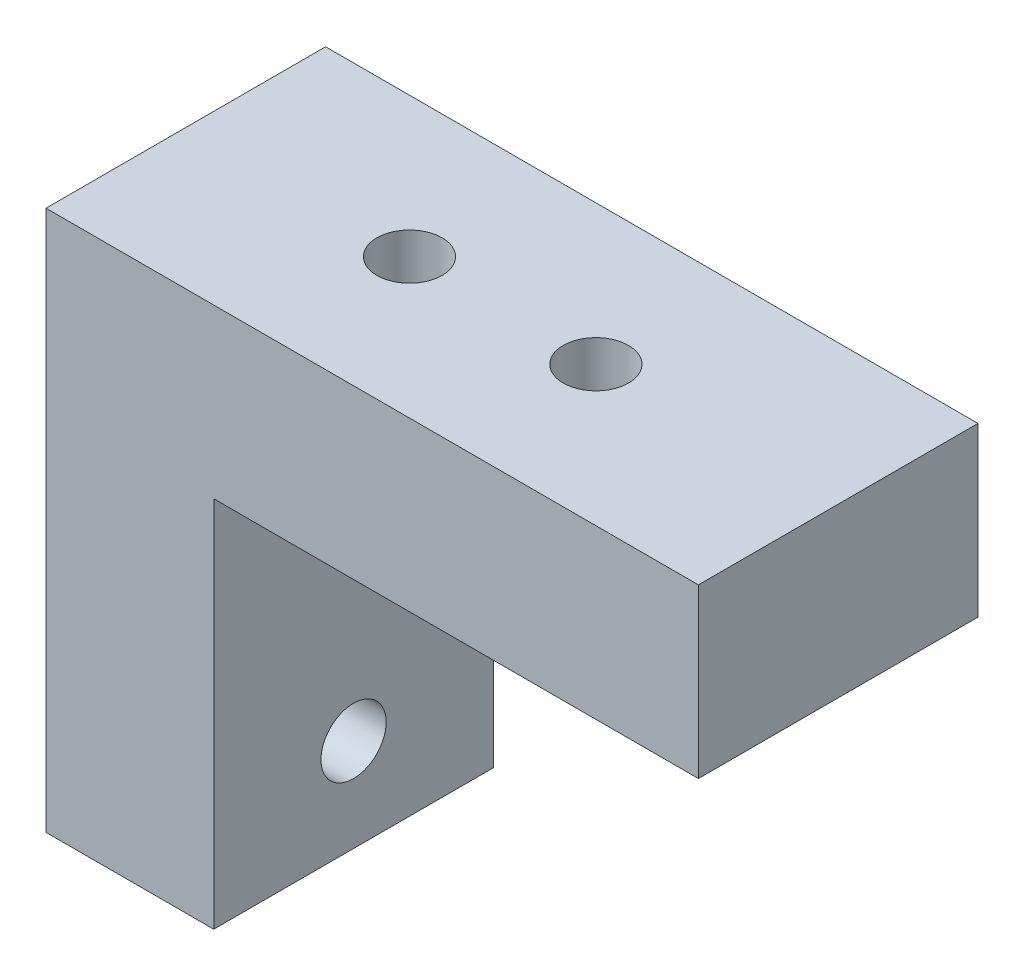
ISO-10303-21;
HEADER;
FILE_DESCRIPTION(('STEP AP214'),'2;1');
FILE_NAME('part.step','',(''),(''),'','','');
FILE_SCHEMA(('AUTOMOTIVE_DESIGN { 1 0 10303 214 1 1 1 1 }'));
ENDSEC;
DATA;
#1=APPLICATION_CONTEXT('core data for automotive mechanical design processes');
#2=APPLICATION_PROTOCOL_DEFINITION('international standard','automotive_design',2000,#1);
#3=PRODUCT_CONTEXT('',#1,'mechanical');
#4=PRODUCT('Part','Part','',(#3));
#5=PRODUCT_RELATED_PRODUCT_CATEGORY('part','',(#4));
#6=PRODUCT_DEFINITION_FORMATION('','',#4);
#7=PRODUCT_DEFINITION_CONTEXT('part definition',#1,'design');
#8=PRODUCT_DEFINITION('design','',#6,#7);
#9=PRODUCT_DEFINITION_SHAPE('','',#8);
#10=(LENGTH_UNIT() NAMED_UNIT(*) SI_UNIT(.MILLI.,.METRE.));
#11=(NAMED_UNIT(*) PLANE_ANGLE_UNIT() SI_UNIT($,.RADIAN.));
#12=(NAMED_UNIT(*) SI_UNIT($,.STERADIAN.) SOLID_ANGLE_UNIT());
#13=UNCERTAINTY_MEASURE_WITH_UNIT(LENGTH_MEASURE(1.E-05),#10,'distance_accuracy_value','');
#14=(GEOMETRIC_REPRESENTATION_CONTEXT(3) GLOBAL_UNCERTAINTY_ASSIGNED_CONTEXT((#13)) GLOBAL_UNIT_ASSIGNED_CONTEXT((#10,
#11,#12)) REPRESENTATION_CONTEXT('',''));
#15=CARTESIAN_POINT('',(0.,0.,0.));
#16=DIRECTION('',(0.,0.,1.));
#17=DIRECTION('',(1.,0.,0.));
#18=AXIS2_PLACEMENT_3D('',#15,#16,#17);
#19=CARTESIAN_POINT('',(9.,-10.7047237110813,4.64763814445934));
#20=DIRECTION('',(0.,0.,-1.));
#21=DIRECTION('',(-1.,0.,0.));
#22=AXIS2_PLACEMENT_3D('',#19,#20,#21);
#23=PLANE('',#22);
#24=DIRECTION('',(0.,-1.,0.));
#25=VECTOR('',#24,1.);
#26=CARTESIAN_POINT('',(0.,-10.7047237110813,4.64763814445934));
#27=LINE('',#26,#25);
#28=CARTESIAN_POINT('',(0.,18.2952762889187,4.64763814445934));
#29=VERTEX_POINT('',#28);
#30=CARTESIAN_POINT('',(0.,-10.7047237110813,4.64763814445934));
#31=VERTEX_POINT('',#30);
#32=EDGE_CURVE('E97',#29,#31,#27,.T.);
#33=ORIENTED_EDGE('',*,*,#32,.T.);
#34=DIRECTION('',(-1.,0.,0.));
#35=VECTOR('',#34,1.);
#36=CARTESIAN_POINT('',(9.,-10.7047237110813,4.64763814445934));
#37=LINE('',#36,#35);
#38=CARTESIAN_POINT('',(9.,-10.7047237110813,4.64763814445934));
#39=VERTEX_POINT('',#38);
#40=EDGE_CURVE('E11',#39,#31,#37,.T.);
#41=ORIENTED_EDGE('',*,*,#40,.F.);
#42=DIRECTION('',(0.,-1.,0.));
#43=VECTOR('',#42,1.);
#44=CARTESIAN_POINT('',(9.,-10.7047237110813,4.64763814445934));
#45=LINE('',#44,#43);
#46=CARTESIAN_POINT('',(9.,9.2952762889187,4.64763814445934));
#47=VERTEX_POINT('',#46);
#48=EDGE_CURVE('E89',#47,#39,#45,.T.);
#49=ORIENTED_EDGE('',*,*,#48,.F.);
#50=DIRECTION('',(1.,0.,0.));
#51=VECTOR('',#50,1.);
#52=CARTESIAN_POINT('',(0.,9.2952762889187,4.64763814445934));
#53=LINE('',#52,#51);
#54=CARTESIAN_POINT('',(35.,9.2952762889187,4.64763814445934));
#55=VERTEX_POINT('',#54);
#56=EDGE_CURVE('E51',#47,#55,#53,.T.);
#57=ORIENTED_EDGE('',*,*,#56,.T.);
#58=DIRECTION('',(0.,-1.,0.));
#59=VECTOR('',#58,1.);
#60=CARTESIAN_POINT('',(35.,18.2952762889187,4.64763814445934));
#61=LINE('',#60,#59);
#62=CARTESIAN_POINT('',(35.,18.2952762889187,4.64763814445934));
#63=VERTEX_POINT('',#62);
#64=EDGE_CURVE('E133',#63,#55,#61,.T.);
#65=ORIENTED_EDGE('',*,*,#64,.F.);
#66=DIRECTION('',(1.,0.,0.));
#67=VECTOR('',#66,1.);
#68=CARTESIAN_POINT('',(0.,18.2952762889187,4.64763814445934));
#69=LINE('',#68,#67);
#70=EDGE_CURVE('E101',#29,#63,#69,.T.);
#71=ORIENTED_EDGE('',*,*,#70,.F.);
#72=EDGE_LOOP('',(#33,#41,#49,#57,#65,#71));
#73=FACE_BOUND('',#72,.T.);
#74=ADVANCED_FACE('F33',(#73),#23,.F.);
#75=CARTESIAN_POINT('',(9.,-10.7047237110813,4.64763814445934));
#76=DIRECTION('',(0.,1.,0.));
#77=DIRECTION('',(0.,0.,1.));
#78=AXIS2_PLACEMENT_3D('',#75,#76,#77);
#79=PLANE('',#78);
#80=DIRECTION('',(0.,0.,-1.));
#81=VECTOR('',#80,1.);
#82=CARTESIAN_POINT('',(0.,-10.7047237110813,4.64763814445934));
#83=LINE('',#82,#81);
#84=CARTESIAN_POINT('',(0.,-10.7047237110813,-10.3523618555407));
#85=VERTEX_POINT('',#84);
#86=EDGE_CURVE('E64',#31,#85,#83,.T.);
#87=ORIENTED_EDGE('',*,*,#86,.T.);
#88=DIRECTION('',(-1.,0.,0.));
#89=VECTOR('',#88,1.);
#90=CARTESIAN_POINT('',(9.,-10.7047237110813,-10.3523618555407));
#91=LINE('',#90,#89);
#92=CARTESIAN_POINT('',(9.,-10.7047237110813,-10.3523618555407));
#93=VERTEX_POINT('',#92);
#94=EDGE_CURVE('E42',#93,#85,#91,.T.);
#95=ORIENTED_EDGE('',*,*,#94,.F.);
#96=DIRECTION('',(0.,0.,-1.));
#97=VECTOR('',#96,1.);
#98=CARTESIAN_POINT('',(9.,-10.7047237110813,4.64763814445934));
#99=LINE('',#98,#97);
#100=EDGE_CURVE('E79',#39,#93,#99,.T.);
#101=ORIENTED_EDGE('',*,*,#100,.F.);
#102=ORIENTED_EDGE('',*,*,#40,.T.);
#103=EDGE_LOOP('',(#87,#95,#101,#102));
#104=FACE_BOUND('',#103,.T.);
#105=ADVANCED_FACE('F81',(#104),#79,.F.);
#106=CARTESIAN_POINT('',(9.,-10.7047237110813,-10.3523618555407));
#107=DIRECTION('',(0.,0.,1.));
#108=DIRECTION('',(1.,0.,0.));
#109=AXIS2_PLACEMENT_3D('',#106,#107,#108);
#110=PLANE('',#109);
#111=DIRECTION('',(0.,1.,0.));
#112=VECTOR('',#111,1.);
#113=CARTESIAN_POINT('',(0.,-10.7047237110813,-10.3523618555407));
#114=LINE('',#113,#112);
#115=CARTESIAN_POINT('',(0.,18.2952762889187,-10.3523618555407));
#116=VERTEX_POINT('',#115);
#117=EDGE_CURVE('E94',#85,#116,#114,.T.);
#118=ORIENTED_EDGE('',*,*,#117,.T.);
#119=DIRECTION('',(-1.,0.,0.));
#120=VECTOR('',#119,1.);
#121=CARTESIAN_POINT('',(0.,18.2952762889187,-10.3523618555407));
#122=LINE('',#121,#120);
#123=CARTESIAN_POINT('',(35.,18.2952762889187,-10.3523618555407));
#124=VERTEX_POINT('',#123);
#125=EDGE_CURVE('E138',#124,#116,#122,.T.);
#126=ORIENTED_EDGE('',*,*,#125,.F.);
#127=DIRECTION('',(0.,-1.,0.));
#128=VECTOR('',#127,1.);
#129=CARTESIAN_POINT('',(35.,18.2952762889187,-10.3523618555407));
#130=LINE('',#129,#128);
#131=CARTESIAN_POINT('',(35.,9.2952762889187,-10.3523618555407));
#132=VERTEX_POINT('',#131);
#133=EDGE_CURVE('E123',#124,#132,#130,.T.);
#134=ORIENTED_EDGE('',*,*,#133,.T.);
#135=DIRECTION('',(-1.,0.,0.));
#136=VECTOR('',#135,1.);
#137=CARTESIAN_POINT('',(0.,9.2952762889187,-10.3523618555407));
#138=LINE('',#137,#136);
#139=CARTESIAN_POINT('',(9.,9.2952762889187,-10.3523618555407));
#140=VERTEX_POINT('',#139);
#141=EDGE_CURVE('E120',#132,#140,#138,.T.);
#142=ORIENTED_EDGE('',*,*,#141,.T.);
#143=DIRECTION('',(0.,1.,0.));
#144=VECTOR('',#143,1.);
#145=CARTESIAN_POINT('',(9.,-10.7047237110813,-10.3523618555407));
#146=LINE('',#145,#144);
#147=EDGE_CURVE('E88',#93,#140,#146,.T.);
#148=ORIENTED_EDGE('',*,*,#147,.F.);
#149=ORIENTED_EDGE('',*,*,#94,.T.);
#150=EDGE_LOOP('',(#118,#126,#134,#142,#148,#149));
#151=FACE_BOUND('',#150,.T.);
#152=ADVANCED_FACE('F118',(#151),#110,.F.);
#153=CARTESIAN_POINT('',(9.,0.,0.));
#154=DIRECTION('',(-1.,0.,0.));
#155=DIRECTION('',(0.,0.,1.));
#156=AXIS2_PLACEMENT_3D('',#153,#154,#155);
#157=PLANE('',#156);
#158=CARTESIAN_POINT('',(9.,4.2952762889187,-2.85236185554066));
#159=DIRECTION('',(1.,0.,0.));
#160=DIRECTION('',(0.,0.,-1.));
#161=AXIS2_PLACEMENT_3D('',#158,#159,#160);
#162=CIRCLE('',#161,1.75);
#163=CARTESIAN_POINT('',(9.,4.2952762889187,-4.60236185554066));
#164=VERTEX_POINT('',#163);
#165=EDGE_CURVE('E140',#164,#164,#162,.T.);
#166=ORIENTED_EDGE('',*,*,#165,.F.);
#167=EDGE_LOOP('',(#166));
#168=FACE_BOUND('',#167,.T.);
#169=CARTESIAN_POINT('',(9.,-5.7047237110813,-2.85236185554066));
#170=DIRECTION('',(1.,0.,0.));
#171=DIRECTION('',(0.,0.,-1.));
#172=AXIS2_PLACEMENT_3D('',#169,#170,#171);
#173=CIRCLE('',#172,1.75);
#174=CARTESIAN_POINT('',(9.,-5.7047237110813,-4.60236185554066));
#175=VERTEX_POINT('',#174);
#176=EDGE_CURVE('E108',#175,#175,#173,.T.);
#177=ORIENTED_EDGE('',*,*,#176,.F.);
#178=EDGE_LOOP('',(#177));
#179=FACE_BOUND('',#178,.T.);
#180=ORIENTED_EDGE('',*,*,#48,.T.);
#181=ORIENTED_EDGE('',*,*,#100,.T.);
#182=ORIENTED_EDGE('',*,*,#147,.T.);
#183=DIRECTION('',(0.,0.,1.));
#184=VECTOR('',#183,1.);
#185=CARTESIAN_POINT('',(9.,9.2952762889187,4.64763814445934));
#186=LINE('',#185,#184);
#187=EDGE_CURVE('E68',#140,#47,#186,.T.);
#188=ORIENTED_EDGE('',*,*,#187,.T.);
#189=EDGE_LOOP('',(#180,#181,#182,#188));
#190=FACE_BOUND('',#189,.T.);
#191=ADVANCED_FACE('F92',(#168,#179,#190),#157,.F.);
#192=CARTESIAN_POINT('',(0.,0.,0.));
#193=DIRECTION('',(-1.,0.,0.));
#194=DIRECTION('',(0.,0.,1.));
#195=AXIS2_PLACEMENT_3D('',#192,#193,#194);
#196=PLANE('',#195);
#197=CARTESIAN_POINT('',(0.,4.2952762889187,-2.85236185554066));
#198=DIRECTION('',(1.,0.,0.));
#199=DIRECTION('',(0.,0.,-1.));
#200=AXIS2_PLACEMENT_3D('',#197,#198,#199);
#201=CIRCLE('',#200,1.75);
#202=CARTESIAN_POINT('',(0.,4.2952762889187,-4.60236185554066));
#203=VERTEX_POINT('',#202);
#204=EDGE_CURVE('E219',#203,#203,#201,.T.);
#205=ORIENTED_EDGE('',*,*,#204,.T.);
#206=EDGE_LOOP('',(#205));
#207=FACE_BOUND('',#206,.T.);
#208=CARTESIAN_POINT('',(0.,-5.7047237110813,-2.85236185554066));
#209=DIRECTION('',(1.,0.,0.));
#210=DIRECTION('',(0.,0.,-1.));
#211=AXIS2_PLACEMENT_3D('',#208,#209,#210);
#212=CIRCLE('',#211,1.75);
#213=CARTESIAN_POINT('',(0.,-5.7047237110813,-4.60236185554066));
#214=VERTEX_POINT('',#213);
#215=EDGE_CURVE('E104',#214,#214,#212,.T.);
#216=ORIENTED_EDGE('',*,*,#215,.T.);
#217=EDGE_LOOP('',(#216));
#218=FACE_BOUND('',#217,.T.);
#219=ORIENTED_EDGE('',*,*,#32,.F.);
#220=DIRECTION('',(0.,0.,1.));
#221=VECTOR('',#220,1.);
#222=CARTESIAN_POINT('',(0.,18.2952762889187,4.64763814445934));
#223=LINE('',#222,#221);
#224=EDGE_CURVE('E124',#116,#29,#223,.T.);
#225=ORIENTED_EDGE('',*,*,#224,.F.);
#226=ORIENTED_EDGE('',*,*,#117,.F.);
#227=ORIENTED_EDGE('',*,*,#86,.F.);
#228=EDGE_LOOP('',(#219,#225,#226,#227));
#229=FACE_BOUND('',#228,.T.);
#230=ADVANCED_FACE('F174',(#207,#218,#229),#196,.T.);
#231=CARTESIAN_POINT('',(0.,-5.7047237110813,-2.85236185554066));
#232=DIRECTION('',(1.,0.,0.));
#233=DIRECTION('',(0.,0.,-1.));
#234=AXIS2_PLACEMENT_3D('',#231,#232,#233);
#235=CYLINDRICAL_SURFACE('',#234,1.75);
#236=ORIENTED_EDGE('',*,*,#215,.F.);
#237=EDGE_LOOP('',(#236));
#238=FACE_BOUND('',#237,.T.);
#239=ORIENTED_EDGE('',*,*,#176,.T.);
#240=EDGE_LOOP('',(#239));
#241=FACE_BOUND('',#240,.T.);
#242=ADVANCED_FACE('F190',(#238,#241),#235,.F.);
#243=CARTESIAN_POINT('',(0.,4.2952762889187,-2.85236185554066));
#244=DIRECTION('',(1.,0.,0.));
#245=DIRECTION('',(0.,0.,-1.));
#246=AXIS2_PLACEMENT_3D('',#243,#244,#245);
#247=CYLINDRICAL_SURFACE('',#246,1.75);
#248=ORIENTED_EDGE('',*,*,#204,.F.);
#249=EDGE_LOOP('',(#248));
#250=FACE_BOUND('',#249,.T.);
#251=ORIENTED_EDGE('',*,*,#165,.T.);
#252=EDGE_LOOP('',(#251));
#253=FACE_BOUND('',#252,.T.);
#254=ADVANCED_FACE('F182',(#250,#253),#247,.F.);
#255=CARTESIAN_POINT('',(0.,9.2952762889187,0.));
#256=DIRECTION('',(0.,-1.,0.));
#257=DIRECTION('',(0.,0.,-1.));
#258=AXIS2_PLACEMENT_3D('',#255,#256,#257);
#259=PLANE('',#258);
#260=CARTESIAN_POINT('',(22.,9.2952762889187,-2.85236185554066));
#261=DIRECTION('',(0.,-1.,0.));
#262=DIRECTION('',(0.,0.,-1.));
#263=AXIS2_PLACEMENT_3D('',#260,#261,#262);
#264=CIRCLE('',#263,1.75);
#265=CARTESIAN_POINT('',(22.,9.2952762889187,-4.60236185554066));
#266=VERTEX_POINT('',#265);
#267=EDGE_CURVE('E156',#266,#266,#264,.T.);
#268=ORIENTED_EDGE('',*,*,#267,.F.);
#269=EDGE_LOOP('',(#268));
#270=FACE_BOUND('',#269,.T.);
#271=CARTESIAN_POINT('',(12.,9.2952762889187,-2.85236185554066));
#272=DIRECTION('',(0.,-1.,0.));
#273=DIRECTION('',(0.,0.,-1.));
#274=AXIS2_PLACEMENT_3D('',#271,#272,#273);
#275=CIRCLE('',#274,1.75);
#276=CARTESIAN_POINT('',(12.,9.2952762889187,-4.60236185554066));
#277=VERTEX_POINT('',#276);
#278=EDGE_CURVE('E150',#277,#277,#275,.T.);
#279=ORIENTED_EDGE('',*,*,#278,.F.);
#280=EDGE_LOOP('',(#279));
#281=FACE_BOUND('',#280,.T.);
#282=ORIENTED_EDGE('',*,*,#187,.F.);
#283=ORIENTED_EDGE('',*,*,#141,.F.);
#284=DIRECTION('',(0.,0.,-1.));
#285=VECTOR('',#284,1.);
#286=CARTESIAN_POINT('',(35.,9.2952762889187,4.64763814445934));
#287=LINE('',#286,#285);
#288=EDGE_CURVE('E125',#55,#132,#287,.T.);
#289=ORIENTED_EDGE('',*,*,#288,.F.);
#290=ORIENTED_EDGE('',*,*,#56,.F.);
#291=EDGE_LOOP('',(#282,#283,#289,#290));
#292=FACE_BOUND('',#291,.T.);
#293=ADVANCED_FACE('F180',(#270,#281,#292),#259,.T.);
#294=CARTESIAN_POINT('',(35.,18.2952762889187,4.64763814445934));
#295=DIRECTION('',(-1.,0.,0.));
#296=DIRECTION('',(0.,0.,1.));
#297=AXIS2_PLACEMENT_3D('',#294,#295,#296);
#298=PLANE('',#297);
#299=ORIENTED_EDGE('',*,*,#288,.T.);
#300=ORIENTED_EDGE('',*,*,#133,.F.);
#301=DIRECTION('',(0.,0.,-1.));
#302=VECTOR('',#301,1.);
#303=CARTESIAN_POINT('',(35.,18.2952762889187,4.64763814445934));
#304=LINE('',#303,#302);
#305=EDGE_CURVE('E142',#63,#124,#304,.T.);
#306=ORIENTED_EDGE('',*,*,#305,.F.);
#307=ORIENTED_EDGE('',*,*,#64,.T.);
#308=EDGE_LOOP('',(#299,#300,#306,#307));
#309=FACE_BOUND('',#308,.T.);
#310=ADVANCED_FACE('F169',(#309),#298,.F.);
#311=CARTESIAN_POINT('',(0.,18.2952762889187,0.));
#312=DIRECTION('',(0.,-1.,0.));
#313=DIRECTION('',(0.,0.,-1.));
#314=AXIS2_PLACEMENT_3D('',#311,#312,#313);
#315=PLANE('',#314);
#316=CARTESIAN_POINT('',(22.,18.2952762889187,-2.85236185554066));
#317=DIRECTION('',(0.,1.,0.));
#318=DIRECTION('',(0.,0.,1.));
#319=AXIS2_PLACEMENT_3D('',#316,#317,#318);
#320=CIRCLE('',#319,1.75);
#321=CARTESIAN_POINT('',(22.,18.2952762889187,-1.10236185554066));
#322=VERTEX_POINT('',#321);
#323=EDGE_CURVE('E159',#322,#322,#320,.T.);
#324=ORIENTED_EDGE('',*,*,#323,.F.);
#325=EDGE_LOOP('',(#324));
#326=FACE_BOUND('',#325,.T.);
#327=CARTESIAN_POINT('',(12.,18.2952762889187,-2.85236185554066));
#328=DIRECTION('',(0.,1.,0.));
#329=DIRECTION('',(0.,0.,1.));
#330=AXIS2_PLACEMENT_3D('',#327,#328,#329);
#331=CIRCLE('',#330,1.75);
#332=CARTESIAN_POINT('',(12.,18.2952762889187,-1.10236185554066));
#333=VERTEX_POINT('',#332);
#334=EDGE_CURVE('E153',#333,#333,#331,.T.);
#335=ORIENTED_EDGE('',*,*,#334,.F.);
#336=EDGE_LOOP('',(#335));
#337=FACE_BOUND('',#336,.T.);
#338=ORIENTED_EDGE('',*,*,#224,.T.);
#339=ORIENTED_EDGE('',*,*,#70,.T.);
#340=ORIENTED_EDGE('',*,*,#305,.T.);
#341=ORIENTED_EDGE('',*,*,#125,.T.);
#342=EDGE_LOOP('',(#338,#339,#340,#341));
#343=FACE_BOUND('',#342,.T.);
#344=ADVANCED_FACE('F165',(#326,#337,#343),#315,.F.);
#345=CARTESIAN_POINT('',(12.,-10.7047487110813,-2.85236185554066));
#346=DIRECTION('',(0.,1.,0.));
#347=DIRECTION('',(0.,0.,1.));
#348=AXIS2_PLACEMENT_3D('',#345,#346,#347);
#349=CYLINDRICAL_SURFACE('',#348,1.75);
#350=ORIENTED_EDGE('',*,*,#278,.T.);
#351=EDGE_LOOP('',(#350));
#352=FACE_BOUND('',#351,.T.);
#353=ORIENTED_EDGE('',*,*,#334,.T.);
#354=EDGE_LOOP('',(#353));
#355=FACE_BOUND('',#354,.T.);
#356=ADVANCED_FACE('F168',(#352,#355),#349,.F.);
#357=CARTESIAN_POINT('',(22.,-10.7047487110813,-2.85236185554066));
#358=DIRECTION('',(0.,1.,0.));
#359=DIRECTION('',(0.,0.,1.));
#360=AXIS2_PLACEMENT_3D('',#357,#358,#359);
#361=CYLINDRICAL_SURFACE('',#360,1.75);
#362=ORIENTED_EDGE('',*,*,#267,.T.);
#363=EDGE_LOOP('',(#362));
#364=FACE_BOUND('',#363,.T.);
#365=ORIENTED_EDGE('',*,*,#323,.T.);
#366=EDGE_LOOP('',(#365));
#367=FACE_BOUND('',#366,.T.);
#368=ADVANCED_FACE('F163',(#364,#367),#361,.F.);
#369=CLOSED_SHELL('',(#74,#105,#152,#191,#230,#242,#254,#293,#310,#344,#356,#368));
#370=MANIFOLD_SOLID_BREP('B2',#369);
#371=ADVANCED_BREP_SHAPE_REPRESENTATION('',(#18,#370),#14);
#372=SHAPE_DEFINITION_REPRESENTATION(#9,#371);
ENDSEC;
END-ISO-10303-21;
